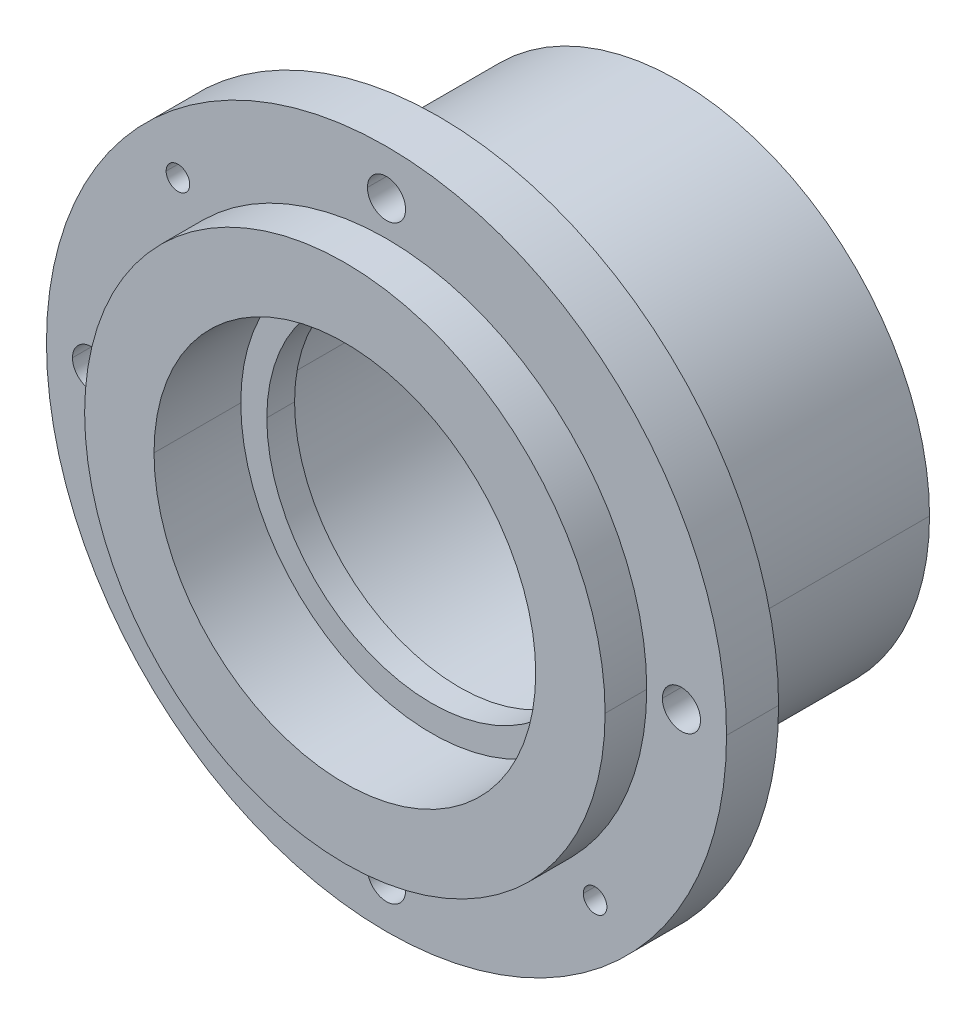
ISO-10303-21;
HEADER;
FILE_DESCRIPTION(('STEP AP214'),'2;1');
FILE_NAME('part.step','',(''),(''),'','','');
FILE_SCHEMA(('AUTOMOTIVE_DESIGN { 1 0 10303 214 1 1 1 1 }'));
ENDSEC;
DATA;
#1=APPLICATION_CONTEXT('core data for automotive mechanical design processes');
#2=APPLICATION_PROTOCOL_DEFINITION('international standard','automotive_design',2000,#1);
#3=PRODUCT_CONTEXT('',#1,'mechanical');
#4=PRODUCT('Part','Part','',(#3));
#5=PRODUCT_RELATED_PRODUCT_CATEGORY('part','',(#4));
#6=PRODUCT_DEFINITION_FORMATION('','',#4);
#7=PRODUCT_DEFINITION_CONTEXT('part definition',#1,'design');
#8=PRODUCT_DEFINITION('design','',#6,#7);
#9=PRODUCT_DEFINITION_SHAPE('','',#8);
#10=(LENGTH_UNIT() NAMED_UNIT(*) SI_UNIT(.MILLI.,.METRE.));
#11=(NAMED_UNIT(*) PLANE_ANGLE_UNIT() SI_UNIT($,.RADIAN.));
#12=(NAMED_UNIT(*) SI_UNIT($,.STERADIAN.) SOLID_ANGLE_UNIT());
#13=UNCERTAINTY_MEASURE_WITH_UNIT(LENGTH_MEASURE(1.E-05),#10,'distance_accuracy_value','');
#14=(GEOMETRIC_REPRESENTATION_CONTEXT(3) GLOBAL_UNCERTAINTY_ASSIGNED_CONTEXT((#13)) GLOBAL_UNIT_ASSIGNED_CONTEXT((#10,
#11,#12)) REPRESENTATION_CONTEXT('',''));
#15=CARTESIAN_POINT('',(0.,0.,0.));
#16=DIRECTION('',(0.,0.,1.));
#17=DIRECTION('',(1.,0.,0.));
#18=AXIS2_PLACEMENT_3D('',#15,#16,#17);
#19=CARTESIAN_POINT('',(60.104076401,-60.104076401,96.5));
#20=DIRECTION('',(0.,0.,-1.));
#21=DIRECTION('',(-1.,0.,0.));
#22=AXIS2_PLACEMENT_3D('',#19,#20,#21);
#23=CYLINDRICAL_SURFACE('',#22,3.4);
#24=DIRECTION('',(0.,0.,-1.));
#25=VECTOR('',#24,1.);
#26=CARTESIAN_POINT('',(63.504076401,-60.104076401,96.5));
#27=LINE('',#26,#25);
#28=CARTESIAN_POINT('',(63.504076401,-60.104076401,104.));
#29=VERTEX_POINT('',#28);
#30=CARTESIAN_POINT('',(63.504076401,-60.104076401,89.));
#31=VERTEX_POINT('',#30);
#32=EDGE_CURVE('E525',#29,#31,#27,.T.);
#33=ORIENTED_EDGE('',*,*,#32,.F.);
#34=CARTESIAN_POINT('',(60.104076401,-60.104076401,104.));
#35=DIRECTION('',(0.,0.,1.));
#36=DIRECTION('',(1.,0.,0.));
#37=AXIS2_PLACEMENT_3D('',#34,#35,#36);
#38=CIRCLE('',#37,3.4);
#39=CARTESIAN_POINT('',(56.704076401,-60.104076401,104.));
#40=VERTEX_POINT('',#39);
#41=EDGE_CURVE('E359',#29,#40,#38,.T.);
#42=ORIENTED_EDGE('',*,*,#41,.T.);
#43=DIRECTION('',(0.,0.,-1.));
#44=VECTOR('',#43,1.);
#45=CARTESIAN_POINT('',(56.704076401,-60.104076401,96.5));
#46=LINE('',#45,#44);
#47=CARTESIAN_POINT('',(56.704076401,-60.104076401,89.));
#48=VERTEX_POINT('',#47);
#49=EDGE_CURVE('E538',#40,#48,#46,.T.);
#50=ORIENTED_EDGE('',*,*,#49,.T.);
#51=CARTESIAN_POINT('',(60.104076401,-60.1040764007128,89.));
#52=DIRECTION('',(0.,0.,-1.));
#53=DIRECTION('',(1.,0.,0.));
#54=AXIS2_PLACEMENT_3D('',#51,#52,#53);
#55=CIRCLE('',#54,3.4);
#56=EDGE_CURVE('E242',#48,#31,#55,.T.);
#57=ORIENTED_EDGE('',*,*,#56,.T.);
#58=EDGE_LOOP('',(#33,#42,#50,#57));
#59=FACE_BOUND('',#58,.T.);
#60=ADVANCED_FACE('F16',(#59),#23,.F.);
#61=CARTESIAN_POINT('',(-60.104076401,60.104076401,96.5));
#62=DIRECTION('',(0.,0.,-1.));
#63=DIRECTION('',(-1.,0.,0.));
#64=AXIS2_PLACEMENT_3D('',#61,#62,#63);
#65=CYLINDRICAL_SURFACE('',#64,3.4);
#66=DIRECTION('',(0.,0.,-1.));
#67=VECTOR('',#66,1.);
#68=CARTESIAN_POINT('',(-56.704076401,60.104076401,96.5));
#69=LINE('',#68,#67);
#70=CARTESIAN_POINT('',(-56.704076401,60.104076401,104.));
#71=VERTEX_POINT('',#70);
#72=CARTESIAN_POINT('',(-56.704076401,60.104076401,89.));
#73=VERTEX_POINT('',#72);
#74=EDGE_CURVE('E256',#71,#73,#69,.T.);
#75=ORIENTED_EDGE('',*,*,#74,.F.);
#76=CARTESIAN_POINT('',(-60.104076401,60.104076401,104.));
#77=DIRECTION('',(0.,0.,1.));
#78=DIRECTION('',(1.,0.,0.));
#79=AXIS2_PLACEMENT_3D('',#76,#77,#78);
#80=CIRCLE('',#79,3.4);
#81=CARTESIAN_POINT('',(-63.504076401,60.104076401,104.));
#82=VERTEX_POINT('',#81);
#83=EDGE_CURVE('E248',#71,#82,#80,.T.);
#84=ORIENTED_EDGE('',*,*,#83,.T.);
#85=DIRECTION('',(0.,0.,-1.));
#86=VECTOR('',#85,1.);
#87=CARTESIAN_POINT('',(-63.504076401,60.104076401,96.5));
#88=LINE('',#87,#86);
#89=CARTESIAN_POINT('',(-63.504076401,60.104076401,89.));
#90=VERTEX_POINT('',#89);
#91=EDGE_CURVE('E246',#82,#90,#88,.T.);
#92=ORIENTED_EDGE('',*,*,#91,.T.);
#93=CARTESIAN_POINT('',(-60.104076401,60.1040764007131,89.));
#94=DIRECTION('',(0.,0.,-1.));
#95=DIRECTION('',(1.,0.,0.));
#96=AXIS2_PLACEMENT_3D('',#93,#94,#95);
#97=CIRCLE('',#96,3.4);
#98=EDGE_CURVE('E232',#90,#73,#97,.T.);
#99=ORIENTED_EDGE('',*,*,#98,.T.);
#100=EDGE_LOOP('',(#75,#84,#92,#99));
#101=FACE_BOUND('',#100,.T.);
#102=ADVANCED_FACE('F247',(#101),#65,.F.);
#103=CARTESIAN_POINT('',(-85.,0.,96.5));
#104=DIRECTION('',(0.,0.,-1.));
#105=DIRECTION('',(-1.,0.,0.));
#106=AXIS2_PLACEMENT_3D('',#103,#104,#105);
#107=CYLINDRICAL_SURFACE('',#106,5.5);
#108=DIRECTION('',(0.,0.,-1.));
#109=VECTOR('',#108,1.);
#110=CARTESIAN_POINT('',(-79.5,0.,96.5));
#111=LINE('',#110,#109);
#112=CARTESIAN_POINT('',(-79.5,0.,104.));
#113=VERTEX_POINT('',#112);
#114=CARTESIAN_POINT('',(-79.5,0.,89.));
#115=VERTEX_POINT('',#114);
#116=EDGE_CURVE('E283',#113,#115,#111,.T.);
#117=ORIENTED_EDGE('',*,*,#116,.F.);
#118=CARTESIAN_POINT('',(-85.,0.,104.));
#119=DIRECTION('',(0.,0.,1.));
#120=DIRECTION('',(1.,0.,0.));
#121=AXIS2_PLACEMENT_3D('',#118,#119,#120);
#122=CIRCLE('',#121,5.5);
#123=CARTESIAN_POINT('',(-90.5,0.,104.));
#124=VERTEX_POINT('',#123);
#125=EDGE_CURVE('E19',#113,#124,#122,.T.);
#126=ORIENTED_EDGE('',*,*,#125,.T.);
#127=DIRECTION('',(0.,0.,-1.));
#128=VECTOR('',#127,1.);
#129=CARTESIAN_POINT('',(-90.5,0.,96.5));
#130=LINE('',#129,#128);
#131=CARTESIAN_POINT('',(-90.5,0.,89.));
#132=VERTEX_POINT('',#131);
#133=EDGE_CURVE('E288',#124,#132,#130,.T.);
#134=ORIENTED_EDGE('',*,*,#133,.T.);
#135=CARTESIAN_POINT('',(-85.,1.78065548281E-12,89.));
#136=DIRECTION('',(0.,0.,-1.));
#137=DIRECTION('',(1.,0.,0.));
#138=AXIS2_PLACEMENT_3D('',#135,#136,#137);
#139=CIRCLE('',#138,5.5);
#140=EDGE_CURVE('E243',#132,#115,#139,.T.);
#141=ORIENTED_EDGE('',*,*,#140,.T.);
#142=EDGE_LOOP('',(#117,#126,#134,#141));
#143=FACE_BOUND('',#142,.T.);
#144=ADVANCED_FACE('F522',(#143),#107,.F.);
#145=CARTESIAN_POINT('',(0.,-85.,96.5));
#146=DIRECTION('',(0.,0.,-1.));
#147=DIRECTION('',(-1.,0.,0.));
#148=AXIS2_PLACEMENT_3D('',#145,#146,#147);
#149=CYLINDRICAL_SURFACE('',#148,5.5);
#150=DIRECTION('',(0.,0.,-1.));
#151=VECTOR('',#150,1.);
#152=CARTESIAN_POINT('',(5.5,-85.,96.5));
#153=LINE('',#152,#151);
#154=CARTESIAN_POINT('',(5.5,-85.,104.));
#155=VERTEX_POINT('',#154);
#156=CARTESIAN_POINT('',(5.5,-85.,89.));
#157=VERTEX_POINT('',#156);
#158=EDGE_CURVE('E302',#155,#157,#153,.T.);
#159=ORIENTED_EDGE('',*,*,#158,.F.);
#160=CARTESIAN_POINT('',(0.,-85.,104.));
#161=DIRECTION('',(0.,0.,1.));
#162=DIRECTION('',(1.,0.,0.));
#163=AXIS2_PLACEMENT_3D('',#160,#161,#162);
#164=CIRCLE('',#163,5.5);
#165=CARTESIAN_POINT('',(-5.5,-85.,104.));
#166=VERTEX_POINT('',#165);
#167=EDGE_CURVE('E463',#155,#166,#164,.T.);
#168=ORIENTED_EDGE('',*,*,#167,.T.);
#169=DIRECTION('',(0.,0.,-1.));
#170=VECTOR('',#169,1.);
#171=CARTESIAN_POINT('',(-5.5,-85.,96.5));
#172=LINE('',#171,#170);
#173=CARTESIAN_POINT('',(-5.5,-85.,89.));
#174=VERTEX_POINT('',#173);
#175=EDGE_CURVE('E306',#166,#174,#172,.T.);
#176=ORIENTED_EDGE('',*,*,#175,.T.);
#177=CARTESIAN_POINT('',(0.,-85.,89.));
#178=DIRECTION('',(0.,0.,-1.));
#179=DIRECTION('',(1.,0.,0.));
#180=AXIS2_PLACEMENT_3D('',#177,#178,#179);
#181=CIRCLE('',#180,5.5);
#182=EDGE_CURVE('E362',#174,#157,#181,.T.);
#183=ORIENTED_EDGE('',*,*,#182,.T.);
#184=EDGE_LOOP('',(#159,#168,#176,#183));
#185=FACE_BOUND('',#184,.T.);
#186=ADVANCED_FACE('F573',(#185),#149,.F.);
#187=CARTESIAN_POINT('',(85.,0.,96.5));
#188=DIRECTION('',(0.,0.,-1.));
#189=DIRECTION('',(-1.,0.,0.));
#190=AXIS2_PLACEMENT_3D('',#187,#188,#189);
#191=CYLINDRICAL_SURFACE('',#190,5.5);
#192=DIRECTION('',(0.,0.,-1.));
#193=VECTOR('',#192,1.);
#194=CARTESIAN_POINT('',(90.5,0.,96.5));
#195=LINE('',#194,#193);
#196=CARTESIAN_POINT('',(90.5,0.,104.));
#197=VERTEX_POINT('',#196);
#198=CARTESIAN_POINT('',(90.5,0.,89.));
#199=VERTEX_POINT('',#198);
#200=EDGE_CURVE('E315',#197,#199,#195,.T.);
#201=ORIENTED_EDGE('',*,*,#200,.F.);
#202=CARTESIAN_POINT('',(85.,0.,104.));
#203=DIRECTION('',(0.,0.,1.));
#204=DIRECTION('',(1.,0.,0.));
#205=AXIS2_PLACEMENT_3D('',#202,#203,#204);
#206=CIRCLE('',#205,5.5);
#207=CARTESIAN_POINT('',(79.5,0.,104.));
#208=VERTEX_POINT('',#207);
#209=EDGE_CURVE('E461',#197,#208,#206,.T.);
#210=ORIENTED_EDGE('',*,*,#209,.T.);
#211=DIRECTION('',(0.,0.,-1.));
#212=VECTOR('',#211,1.);
#213=CARTESIAN_POINT('',(79.5,0.,96.5));
#214=LINE('',#213,#212);
#215=CARTESIAN_POINT('',(79.5,0.,89.));
#216=VERTEX_POINT('',#215);
#217=EDGE_CURVE('E323',#208,#216,#214,.T.);
#218=ORIENTED_EDGE('',*,*,#217,.T.);
#219=CARTESIAN_POINT('',(85.,-5.93551827603332E-13,89.));
#220=DIRECTION('',(0.,0.,-1.));
#221=DIRECTION('',(1.,0.,0.));
#222=AXIS2_PLACEMENT_3D('',#219,#220,#221);
#223=CIRCLE('',#222,5.5);
#224=EDGE_CURVE('E408',#216,#199,#223,.T.);
#225=ORIENTED_EDGE('',*,*,#224,.T.);
#226=EDGE_LOOP('',(#201,#210,#218,#225));
#227=FACE_BOUND('',#226,.T.);
#228=ADVANCED_FACE('F580',(#227),#191,.F.);
#229=CARTESIAN_POINT('',(0.,85.,96.5));
#230=DIRECTION('',(0.,0.,-1.));
#231=DIRECTION('',(-1.,0.,0.));
#232=AXIS2_PLACEMENT_3D('',#229,#230,#231);
#233=CYLINDRICAL_SURFACE('',#232,5.5);
#234=DIRECTION('',(0.,0.,-1.));
#235=VECTOR('',#234,1.);
#236=CARTESIAN_POINT('',(5.5,85.,96.5));
#237=LINE('',#236,#235);
#238=CARTESIAN_POINT('',(5.5,85.,104.));
#239=VERTEX_POINT('',#238);
#240=CARTESIAN_POINT('',(5.5,85.,89.));
#241=VERTEX_POINT('',#240);
#242=EDGE_CURVE('E289',#239,#241,#237,.T.);
#243=ORIENTED_EDGE('',*,*,#242,.F.);
#244=CARTESIAN_POINT('',(0.,85.,104.));
#245=DIRECTION('',(0.,0.,1.));
#246=DIRECTION('',(1.,0.,0.));
#247=AXIS2_PLACEMENT_3D('',#244,#245,#246);
#248=CIRCLE('',#247,5.5);
#249=CARTESIAN_POINT('',(-5.5,85.,104.));
#250=VERTEX_POINT('',#249);
#251=EDGE_CURVE('E267',#239,#250,#248,.T.);
#252=ORIENTED_EDGE('',*,*,#251,.T.);
#253=DIRECTION('',(0.,0.,-1.));
#254=VECTOR('',#253,1.);
#255=CARTESIAN_POINT('',(-5.5,85.,96.5));
#256=LINE('',#255,#254);
#257=CARTESIAN_POINT('',(-5.5,85.,89.));
#258=VERTEX_POINT('',#257);
#259=EDGE_CURVE('E339',#250,#258,#256,.T.);
#260=ORIENTED_EDGE('',*,*,#259,.T.);
#261=CARTESIAN_POINT('',(0.,85.,89.));
#262=DIRECTION('',(0.,0.,-1.));
#263=DIRECTION('',(1.,0.,0.));
#264=AXIS2_PLACEMENT_3D('',#261,#262,#263);
#265=CIRCLE('',#264,5.5);
#266=EDGE_CURVE('E271',#258,#241,#265,.T.);
#267=ORIENTED_EDGE('',*,*,#266,.T.);
#268=EDGE_LOOP('',(#243,#252,#260,#267));
#269=FACE_BOUND('',#268,.T.);
#270=ADVANCED_FACE('F477',(#269),#233,.F.);
#271=CARTESIAN_POINT('',(0.,0.,103.5));
#272=DIRECTION('',(0.,0.,1.));
#273=DIRECTION('',(1.,0.,0.));
#274=AXIS2_PLACEMENT_3D('',#271,#272,#273);
#275=CYLINDRICAL_SURFACE('',#274,55.);
#276=DIRECTION('',(0.,0.,1.));
#277=VECTOR('',#276,1.);
#278=CARTESIAN_POINT('',(-55.,0.,103.5));
#279=LINE('',#278,#277);
#280=CARTESIAN_POINT('',(-55.,0.,91.));
#281=VERTEX_POINT('',#280);
#282=CARTESIAN_POINT('',(-55.,0.,116.));
#283=VERTEX_POINT('',#282);
#284=EDGE_CURVE('E347',#281,#283,#279,.T.);
#285=ORIENTED_EDGE('',*,*,#284,.F.);
#286=CARTESIAN_POINT('',(0.,0.,91.));
#287=DIRECTION('',(0.,0.,1.));
#288=DIRECTION('',(1.,0.,0.));
#289=AXIS2_PLACEMENT_3D('',#286,#287,#288);
#290=CIRCLE('',#289,55.);
#291=CARTESIAN_POINT('',(55.,0.,91.));
#292=VERTEX_POINT('',#291);
#293=EDGE_CURVE('E455',#292,#281,#290,.T.);
#294=ORIENTED_EDGE('',*,*,#293,.F.);
#295=DIRECTION('',(0.,0.,1.));
#296=VECTOR('',#295,1.);
#297=CARTESIAN_POINT('',(55.,0.,103.5));
#298=LINE('',#297,#296);
#299=CARTESIAN_POINT('',(55.,0.,116.));
#300=VERTEX_POINT('',#299);
#301=EDGE_CURVE('E366',#292,#300,#298,.T.);
#302=ORIENTED_EDGE('',*,*,#301,.T.);
#303=CARTESIAN_POINT('',(0.,0.,116.));
#304=DIRECTION('',(0.,0.,1.));
#305=DIRECTION('',(1.,0.,0.));
#306=AXIS2_PLACEMENT_3D('',#303,#304,#305);
#307=CIRCLE('',#306,55.);
#308=EDGE_CURVE('E10',#300,#283,#307,.T.);
#309=ORIENTED_EDGE('',*,*,#308,.T.);
#310=EDGE_LOOP('',(#285,#294,#302,#309));
#311=FACE_BOUND('',#310,.T.);
#312=ADVANCED_FACE('F609',(#311),#275,.F.);
#313=CARTESIAN_POINT('',(0.,0.,110.));
#314=DIRECTION('',(0.,0.,1.));
#315=DIRECTION('',(1.,0.,0.));
#316=AXIS2_PLACEMENT_3D('',#313,#314,#315);
#317=CYLINDRICAL_SURFACE('',#316,75.);
#318=DIRECTION('',(0.,0.,1.));
#319=VECTOR('',#318,1.);
#320=CARTESIAN_POINT('',(-75.,0.,110.));
#321=LINE('',#320,#319);
#322=CARTESIAN_POINT('',(-75.,0.,104.));
#323=VERTEX_POINT('',#322);
#324=CARTESIAN_POINT('',(-75.,0.,116.));
#325=VERTEX_POINT('',#324);
#326=EDGE_CURVE('E374',#323,#325,#321,.T.);
#327=ORIENTED_EDGE('',*,*,#326,.F.);
#328=CARTESIAN_POINT('',(0.,0.,104.));
#329=DIRECTION('',(0.,0.,1.));
#330=DIRECTION('',(1.,0.,0.));
#331=AXIS2_PLACEMENT_3D('',#328,#329,#330);
#332=CIRCLE('',#331,75.);
#333=CARTESIAN_POINT('',(75.,0.,104.));
#334=VERTEX_POINT('',#333);
#335=EDGE_CURVE('E432',#323,#334,#332,.T.);
#336=ORIENTED_EDGE('',*,*,#335,.T.);
#337=DIRECTION('',(0.,0.,1.));
#338=VECTOR('',#337,1.);
#339=CARTESIAN_POINT('',(75.,0.,110.));
#340=LINE('',#339,#338);
#341=CARTESIAN_POINT('',(75.,0.,116.));
#342=VERTEX_POINT('',#341);
#343=EDGE_CURVE('E379',#334,#342,#340,.T.);
#344=ORIENTED_EDGE('',*,*,#343,.T.);
#345=CARTESIAN_POINT('',(0.,0.,116.));
#346=DIRECTION('',(0.,0.,1.));
#347=DIRECTION('',(1.,0.,0.));
#348=AXIS2_PLACEMENT_3D('',#345,#346,#347);
#349=CIRCLE('',#348,75.);
#350=EDGE_CURVE('E25',#325,#342,#349,.T.);
#351=ORIENTED_EDGE('',*,*,#350,.F.);
#352=EDGE_LOOP('',(#327,#336,#344,#351));
#353=FACE_BOUND('',#352,.T.);
#354=ADVANCED_FACE('F606',(#353),#317,.T.);
#355=CARTESIAN_POINT('',(0.,0.,96.5));
#356=DIRECTION('',(0.,0.,-1.));
#357=DIRECTION('',(-1.,0.,0.));
#358=AXIS2_PLACEMENT_3D('',#355,#356,#357);
#359=CYLINDRICAL_SURFACE('',#358,98.);
#360=DIRECTION('',(0.,0.,-1.));
#361=VECTOR('',#360,1.);
#362=CARTESIAN_POINT('',(98.,0.,96.5));
#363=LINE('',#362,#361);
#364=CARTESIAN_POINT('',(98.,0.,104.));
#365=VERTEX_POINT('',#364);
#366=CARTESIAN_POINT('',(98.,0.,89.));
#367=VERTEX_POINT('',#366);
#368=EDGE_CURVE('E387',#365,#367,#363,.T.);
#369=ORIENTED_EDGE('',*,*,#368,.F.);
#370=CARTESIAN_POINT('',(0.,0.,104.));
#371=DIRECTION('',(0.,0.,1.));
#372=DIRECTION('',(1.,0.,0.));
#373=AXIS2_PLACEMENT_3D('',#370,#371,#372);
#374=CIRCLE('',#373,98.);
#375=CARTESIAN_POINT('',(-98.,0.,104.));
#376=VERTEX_POINT('',#375);
#377=EDGE_CURVE('E429',#376,#365,#374,.T.);
#378=ORIENTED_EDGE('',*,*,#377,.F.);
#379=DIRECTION('',(0.,0.,-1.));
#380=VECTOR('',#379,1.);
#381=CARTESIAN_POINT('',(-98.,0.,96.5));
#382=LINE('',#381,#380);
#383=CARTESIAN_POINT('',(-98.,-7.08333419676543E-13,89.));
#384=VERTEX_POINT('',#383);
#385=EDGE_CURVE('E397',#376,#384,#382,.T.);
#386=ORIENTED_EDGE('',*,*,#385,.T.);
#387=CARTESIAN_POINT('',(0.,0.,89.));
#388=DIRECTION('',(0.,0.,-1.));
#389=DIRECTION('',(-1.,0.,0.));
#390=AXIS2_PLACEMENT_3D('',#387,#388,#389);
#391=CIRCLE('',#390,98.);
#392=EDGE_CURVE('E272',#367,#384,#391,.T.);
#393=ORIENTED_EDGE('',*,*,#392,.F.);
#394=EDGE_LOOP('',(#369,#378,#386,#393));
#395=FACE_BOUND('',#394,.T.);
#396=ADVANCED_FACE('F496',(#395),#359,.T.);
#397=CARTESIAN_POINT('',(0.,0.,87.));
#398=DIRECTION('',(0.,0.,-1.));
#399=DIRECTION('',(-1.,0.,0.));
#400=AXIS2_PLACEMENT_3D('',#397,#398,#399);
#401=CYLINDRICAL_SURFACE('',#400,47.5);
#402=DIRECTION('',(0.,0.,-1.));
#403=VECTOR('',#402,1.);
#404=CARTESIAN_POINT('',(47.5,0.,87.));
#405=LINE('',#404,#403);
#406=CARTESIAN_POINT('',(47.5,0.,91.));
#407=VERTEX_POINT('',#406);
#408=CARTESIAN_POINT('',(47.5,0.,83.));
#409=VERTEX_POINT('',#408);
#410=EDGE_CURVE('E405',#407,#409,#405,.T.);
#411=ORIENTED_EDGE('',*,*,#410,.F.);
#412=CARTESIAN_POINT('',(0.,0.,91.));
#413=DIRECTION('',(0.,0.,1.));
#414=DIRECTION('',(1.,0.,0.));
#415=AXIS2_PLACEMENT_3D('',#412,#413,#414);
#416=CIRCLE('',#415,47.5);
#417=CARTESIAN_POINT('',(-47.5,0.,91.));
#418=VERTEX_POINT('',#417);
#419=EDGE_CURVE('E433',#407,#418,#416,.T.);
#420=ORIENTED_EDGE('',*,*,#419,.T.);
#421=DIRECTION('',(0.,0.,-1.));
#422=VECTOR('',#421,1.);
#423=CARTESIAN_POINT('',(-47.5,0.,87.));
#424=LINE('',#423,#422);
#425=CARTESIAN_POINT('',(-47.5,0.,83.));
#426=VERTEX_POINT('',#425);
#427=EDGE_CURVE('E279',#418,#426,#424,.T.);
#428=ORIENTED_EDGE('',*,*,#427,.T.);
#429=CARTESIAN_POINT('',(0.,0.,83.));
#430=DIRECTION('',(0.,0.,-1.));
#431=DIRECTION('',(1.,0.,0.));
#432=AXIS2_PLACEMENT_3D('',#429,#430,#431);
#433=CIRCLE('',#432,47.5);
#434=EDGE_CURVE('E305',#426,#409,#433,.T.);
#435=ORIENTED_EDGE('',*,*,#434,.T.);
#436=EDGE_LOOP('',(#411,#420,#428,#435));
#437=FACE_BOUND('',#436,.T.);
#438=ADVANCED_FACE('F597',(#437),#401,.F.);
#439=CARTESIAN_POINT('',(0.,0.,51.5));
#440=DIRECTION('',(0.,0.,-1.));
#441=DIRECTION('',(-1.,0.,0.));
#442=AXIS2_PLACEMENT_3D('',#439,#440,#441);
#443=CYLINDRICAL_SURFACE('',#442,55.);
#444=DIRECTION('',(0.,0.,-1.));
#445=VECTOR('',#444,1.);
#446=CARTESIAN_POINT('',(55.,0.,51.5));
#447=LINE('',#446,#445);
#448=CARTESIAN_POINT('',(55.,0.,83.));
#449=VERTEX_POINT('',#448);
#450=CARTESIAN_POINT('',(55.,0.,20.));
#451=VERTEX_POINT('',#450);
#452=EDGE_CURVE('E278',#449,#451,#447,.T.);
#453=ORIENTED_EDGE('',*,*,#452,.F.);
#454=CARTESIAN_POINT('',(0.,0.,83.));
#455=DIRECTION('',(0.,0.,-1.));
#456=DIRECTION('',(1.,0.,0.));
#457=AXIS2_PLACEMENT_3D('',#454,#455,#456);
#458=CIRCLE('',#457,55.);
#459=CARTESIAN_POINT('',(-55.,0.,83.));
#460=VERTEX_POINT('',#459);
#461=EDGE_CURVE('E444',#460,#449,#458,.T.);
#462=ORIENTED_EDGE('',*,*,#461,.F.);
#463=DIRECTION('',(0.,0.,-1.));
#464=VECTOR('',#463,1.);
#465=CARTESIAN_POINT('',(-55.,0.,51.5));
#466=LINE('',#465,#464);
#467=CARTESIAN_POINT('',(-55.,0.,20.));
#468=VERTEX_POINT('',#467);
#469=EDGE_CURVE('E352',#460,#468,#466,.T.);
#470=ORIENTED_EDGE('',*,*,#469,.T.);
#471=CARTESIAN_POINT('',(0.,0.,20.));
#472=DIRECTION('',(0.,0.,1.));
#473=DIRECTION('',(1.,0.,0.));
#474=AXIS2_PLACEMENT_3D('',#471,#472,#473);
#475=CIRCLE('',#474,55.);
#476=EDGE_CURVE('E441',#451,#468,#475,.T.);
#477=ORIENTED_EDGE('',*,*,#476,.F.);
#478=EDGE_LOOP('',(#453,#462,#470,#477));
#479=FACE_BOUND('',#478,.T.);
#480=ADVANCED_FACE('F589',(#479),#443,.F.);
#481=CARTESIAN_POINT('',(0.,0.,54.5));
#482=DIRECTION('',(0.,0.,-1.));
#483=DIRECTION('',(-1.,0.,0.));
#484=AXIS2_PLACEMENT_3D('',#481,#482,#483);
#485=CYLINDRICAL_SURFACE('',#484,72.5);
#486=DIRECTION('',(0.,0.,-1.));
#487=VECTOR('',#486,1.);
#488=CARTESIAN_POINT('',(72.5,0.,54.5));
#489=LINE('',#488,#487);
#490=CARTESIAN_POINT('',(72.5,0.,89.));
#491=VERTEX_POINT('',#490);
#492=CARTESIAN_POINT('',(72.5,0.,20.));
#493=VERTEX_POINT('',#492);
#494=EDGE_CURVE('E335',#491,#493,#489,.T.);
#495=ORIENTED_EDGE('',*,*,#494,.F.);
#496=CARTESIAN_POINT('',(0.,0.,89.));
#497=DIRECTION('',(0.,0.,-1.));
#498=DIRECTION('',(-1.,0.,0.));
#499=AXIS2_PLACEMENT_3D('',#496,#497,#498);
#500=CIRCLE('',#499,72.5);
#501=CARTESIAN_POINT('',(-72.5,-5.24022172719891E-13,89.));
#502=VERTEX_POINT('',#501);
#503=EDGE_CURVE('E269',#491,#502,#500,.T.);
#504=ORIENTED_EDGE('',*,*,#503,.T.);
#505=DIRECTION('',(0.,0.,-1.));
#506=VECTOR('',#505,1.);
#507=CARTESIAN_POINT('',(-72.5,0.,54.5));
#508=LINE('',#507,#506);
#509=CARTESIAN_POINT('',(-72.5,0.,20.));
#510=VERTEX_POINT('',#509);
#511=EDGE_CURVE('E334',#502,#510,#508,.T.);
#512=ORIENTED_EDGE('',*,*,#511,.T.);
#513=CARTESIAN_POINT('',(0.,0.,20.));
#514=DIRECTION('',(0.,0.,1.));
#515=DIRECTION('',(1.,0.,0.));
#516=AXIS2_PLACEMENT_3D('',#513,#514,#515);
#517=CIRCLE('',#516,72.5);
#518=EDGE_CURVE('E38',#510,#493,#517,.T.);
#519=ORIENTED_EDGE('',*,*,#518,.T.);
#520=EDGE_LOOP('',(#495,#504,#512,#519));
#521=FACE_BOUND('',#520,.T.);
#522=ADVANCED_FACE('F587',(#521),#485,.T.);
#523=CARTESIAN_POINT('',(0.,0.,116.));
#524=DIRECTION('',(0.,0.,1.));
#525=DIRECTION('',(1.,0.,0.));
#526=AXIS2_PLACEMENT_3D('',#523,#524,#525);
#527=PLANE('',#526);
#528=ORIENTED_EDGE('',*,*,#308,.F.);
#529=CARTESIAN_POINT('',(0.,0.,116.));
#530=DIRECTION('',(0.,0.,1.));
#531=DIRECTION('',(1.,0.,0.));
#532=AXIS2_PLACEMENT_3D('',#529,#530,#531);
#533=CIRCLE('',#532,55.);
#534=EDGE_CURVE('E356',#283,#300,#533,.T.);
#535=ORIENTED_EDGE('',*,*,#534,.F.);
#536=EDGE_LOOP('',(#528,#535));
#537=FACE_BOUND('',#536,.T.);
#538=CARTESIAN_POINT('',(0.,0.,116.));
#539=DIRECTION('',(0.,0.,1.));
#540=DIRECTION('',(1.,0.,0.));
#541=AXIS2_PLACEMENT_3D('',#538,#539,#540);
#542=CIRCLE('',#541,75.);
#543=EDGE_CURVE('E375',#342,#325,#542,.T.);
#544=ORIENTED_EDGE('',*,*,#543,.T.);
#545=ORIENTED_EDGE('',*,*,#350,.T.);
#546=EDGE_LOOP('',(#544,#545));
#547=FACE_BOUND('',#546,.T.);
#548=ADVANCED_FACE('F487',(#537,#547),#527,.T.);
#549=CARTESIAN_POINT('',(0.,0.,104.));
#550=DIRECTION('',(0.,0.,1.));
#551=DIRECTION('',(1.,0.,0.));
#552=AXIS2_PLACEMENT_3D('',#549,#550,#551);
#553=PLANE('',#552);
#554=CARTESIAN_POINT('',(60.104076401,-60.104076401,104.));
#555=DIRECTION('',(0.,0.,1.));
#556=DIRECTION('',(1.,0.,0.));
#557=AXIS2_PLACEMENT_3D('',#554,#555,#556);
#558=CIRCLE('',#557,3.4);
#559=EDGE_CURVE('E534',#40,#29,#558,.T.);
#560=ORIENTED_EDGE('',*,*,#559,.F.);
#561=ORIENTED_EDGE('',*,*,#41,.F.);
#562=EDGE_LOOP('',(#560,#561));
#563=FACE_BOUND('',#562,.T.);
#564=CARTESIAN_POINT('',(-60.104076401,60.104076401,104.));
#565=DIRECTION('',(0.,0.,1.));
#566=DIRECTION('',(1.,0.,0.));
#567=AXIS2_PLACEMENT_3D('',#564,#565,#566);
#568=CIRCLE('',#567,3.4);
#569=EDGE_CURVE('E263',#82,#71,#568,.T.);
#570=ORIENTED_EDGE('',*,*,#569,.F.);
#571=ORIENTED_EDGE('',*,*,#83,.F.);
#572=EDGE_LOOP('',(#570,#571));
#573=FACE_BOUND('',#572,.T.);
#574=CARTESIAN_POINT('',(-85.,0.,104.));
#575=DIRECTION('',(0.,0.,1.));
#576=DIRECTION('',(1.,0.,0.));
#577=AXIS2_PLACEMENT_3D('',#574,#575,#576);
#578=CIRCLE('',#577,5.5);
#579=EDGE_CURVE('E253',#124,#113,#578,.T.);
#580=ORIENTED_EDGE('',*,*,#579,.F.);
#581=ORIENTED_EDGE('',*,*,#125,.F.);
#582=EDGE_LOOP('',(#580,#581));
#583=FACE_BOUND('',#582,.T.);
#584=CARTESIAN_POINT('',(0.,-85.,104.));
#585=DIRECTION('',(0.,0.,1.));
#586=DIRECTION('',(1.,0.,0.));
#587=AXIS2_PLACEMENT_3D('',#584,#585,#586);
#588=CIRCLE('',#587,5.5);
#589=EDGE_CURVE('E298',#166,#155,#588,.T.);
#590=ORIENTED_EDGE('',*,*,#589,.F.);
#591=ORIENTED_EDGE('',*,*,#167,.F.);
#592=EDGE_LOOP('',(#590,#591));
#593=FACE_BOUND('',#592,.T.);
#594=CARTESIAN_POINT('',(85.,0.,104.));
#595=DIRECTION('',(0.,0.,1.));
#596=DIRECTION('',(1.,0.,0.));
#597=AXIS2_PLACEMENT_3D('',#594,#595,#596);
#598=CIRCLE('',#597,5.5);
#599=EDGE_CURVE('E310',#208,#197,#598,.T.);
#600=ORIENTED_EDGE('',*,*,#599,.F.);
#601=ORIENTED_EDGE('',*,*,#209,.F.);
#602=EDGE_LOOP('',(#600,#601));
#603=FACE_BOUND('',#602,.T.);
#604=CARTESIAN_POINT('',(0.,85.,104.));
#605=DIRECTION('',(0.,0.,1.));
#606=DIRECTION('',(1.,0.,0.));
#607=AXIS2_PLACEMENT_3D('',#604,#605,#606);
#608=CIRCLE('',#607,5.5);
#609=EDGE_CURVE('E294',#250,#239,#608,.T.);
#610=ORIENTED_EDGE('',*,*,#609,.F.);
#611=ORIENTED_EDGE('',*,*,#251,.F.);
#612=EDGE_LOOP('',(#610,#611));
#613=FACE_BOUND('',#612,.T.);
#614=CARTESIAN_POINT('',(0.,0.,104.));
#615=DIRECTION('',(0.,0.,1.));
#616=DIRECTION('',(1.,0.,0.));
#617=AXIS2_PLACEMENT_3D('',#614,#615,#616);
#618=CIRCLE('',#617,75.);
#619=EDGE_CURVE('E370',#334,#323,#618,.T.);
#620=ORIENTED_EDGE('',*,*,#619,.F.);
#621=ORIENTED_EDGE('',*,*,#335,.F.);
#622=EDGE_LOOP('',(#620,#621));
#623=FACE_BOUND('',#622,.T.);
#624=ORIENTED_EDGE('',*,*,#377,.T.);
#625=CARTESIAN_POINT('',(0.,0.,104.));
#626=DIRECTION('',(0.,0.,1.));
#627=DIRECTION('',(1.,0.,0.));
#628=AXIS2_PLACEMENT_3D('',#625,#626,#627);
#629=CIRCLE('',#628,98.);
#630=EDGE_CURVE('E383',#365,#376,#629,.T.);
#631=ORIENTED_EDGE('',*,*,#630,.T.);
#632=EDGE_LOOP('',(#624,#631));
#633=FACE_BOUND('',#632,.T.);
#634=ADVANCED_FACE('F483',(#563,#573,#583,#593,#603,#613,#623,#633),#553,.T.);
#635=CARTESIAN_POINT('',(0.,0.,91.));
#636=DIRECTION('',(0.,0.,1.));
#637=DIRECTION('',(1.,0.,0.));
#638=AXIS2_PLACEMENT_3D('',#635,#636,#637);
#639=PLANE('',#638);
#640=CARTESIAN_POINT('',(0.,0.,91.));
#641=DIRECTION('',(0.,0.,1.));
#642=DIRECTION('',(1.,0.,0.));
#643=AXIS2_PLACEMENT_3D('',#640,#641,#642);
#644=CIRCLE('',#643,47.5);
#645=EDGE_CURVE('E401',#418,#407,#644,.T.);
#646=ORIENTED_EDGE('',*,*,#645,.F.);
#647=ORIENTED_EDGE('',*,*,#419,.F.);
#648=EDGE_LOOP('',(#646,#647));
#649=FACE_BOUND('',#648,.T.);
#650=ORIENTED_EDGE('',*,*,#293,.T.);
#651=CARTESIAN_POINT('',(0.,0.,91.));
#652=DIRECTION('',(0.,0.,1.));
#653=DIRECTION('',(1.,0.,0.));
#654=AXIS2_PLACEMENT_3D('',#651,#652,#653);
#655=CIRCLE('',#654,55.);
#656=EDGE_CURVE('E343',#281,#292,#655,.T.);
#657=ORIENTED_EDGE('',*,*,#656,.T.);
#658=EDGE_LOOP('',(#650,#657));
#659=FACE_BOUND('',#658,.T.);
#660=ADVANCED_FACE('F486',(#649,#659),#639,.T.);
#661=CARTESIAN_POINT('',(0.,0.,89.));
#662=DIRECTION('',(0.,0.,-1.));
#663=DIRECTION('',(0.,-1.,0.));
#664=AXIS2_PLACEMENT_3D('',#661,#662,#663);
#665=PLANE('',#664);
#666=ORIENTED_EDGE('',*,*,#56,.F.);
#667=CARTESIAN_POINT('',(60.104076401,-60.1040764007128,89.));
#668=DIRECTION('',(0.,0.,-1.));
#669=DIRECTION('',(1.,0.,0.));
#670=AXIS2_PLACEMENT_3D('',#667,#668,#669);
#671=CIRCLE('',#670,3.4);
#672=EDGE_CURVE('E533',#31,#48,#671,.T.);
#673=ORIENTED_EDGE('',*,*,#672,.F.);
#674=EDGE_LOOP('',(#666,#673));
#675=FACE_BOUND('',#674,.T.);
#676=ORIENTED_EDGE('',*,*,#98,.F.);
#677=CARTESIAN_POINT('',(-60.104076401,60.1040764007131,89.));
#678=DIRECTION('',(0.,0.,-1.));
#679=DIRECTION('',(1.,0.,0.));
#680=AXIS2_PLACEMENT_3D('',#677,#678,#679);
#681=CIRCLE('',#680,3.4);
#682=EDGE_CURVE('E237',#73,#90,#681,.T.);
#683=ORIENTED_EDGE('',*,*,#682,.F.);
#684=EDGE_LOOP('',(#676,#683));
#685=FACE_BOUND('',#684,.T.);
#686=ORIENTED_EDGE('',*,*,#140,.F.);
#687=CARTESIAN_POINT('',(-85.,1.78065548281E-12,89.));
#688=DIRECTION('',(0.,0.,-1.));
#689=DIRECTION('',(1.,0.,0.));
#690=AXIS2_PLACEMENT_3D('',#687,#688,#689);
#691=CIRCLE('',#690,5.5);
#692=EDGE_CURVE('E284',#115,#132,#691,.T.);
#693=ORIENTED_EDGE('',*,*,#692,.F.);
#694=EDGE_LOOP('',(#686,#693));
#695=FACE_BOUND('',#694,.T.);
#696=ORIENTED_EDGE('',*,*,#182,.F.);
#697=CARTESIAN_POINT('',(0.,-85.,89.));
#698=DIRECTION('',(0.,0.,-1.));
#699=DIRECTION('',(1.,0.,0.));
#700=AXIS2_PLACEMENT_3D('',#697,#698,#699);
#701=CIRCLE('',#700,5.5);
#702=EDGE_CURVE('E311',#157,#174,#701,.T.);
#703=ORIENTED_EDGE('',*,*,#702,.F.);
#704=EDGE_LOOP('',(#696,#703));
#705=FACE_BOUND('',#704,.T.);
#706=ORIENTED_EDGE('',*,*,#224,.F.);
#707=CARTESIAN_POINT('',(85.,-5.93551827603332E-13,89.));
#708=DIRECTION('',(0.,0.,-1.));
#709=DIRECTION('',(1.,0.,0.));
#710=AXIS2_PLACEMENT_3D('',#707,#708,#709);
#711=CIRCLE('',#710,5.5);
#712=EDGE_CURVE('E319',#199,#216,#711,.T.);
#713=ORIENTED_EDGE('',*,*,#712,.F.);
#714=EDGE_LOOP('',(#706,#713));
#715=FACE_BOUND('',#714,.T.);
#716=ORIENTED_EDGE('',*,*,#266,.F.);
#717=CARTESIAN_POINT('',(0.,85.,89.));
#718=DIRECTION('',(0.,0.,-1.));
#719=DIRECTION('',(1.,0.,0.));
#720=AXIS2_PLACEMENT_3D('',#717,#718,#719);
#721=CIRCLE('',#720,5.5);
#722=EDGE_CURVE('E293',#241,#258,#721,.T.);
#723=ORIENTED_EDGE('',*,*,#722,.F.);
#724=EDGE_LOOP('',(#716,#723));
#725=FACE_BOUND('',#724,.T.);
#726=CARTESIAN_POINT('',(0.,0.,89.));
#727=DIRECTION('',(0.,0.,-1.));
#728=DIRECTION('',(-1.,0.,0.));
#729=AXIS2_PLACEMENT_3D('',#726,#727,#728);
#730=CIRCLE('',#729,72.5);
#731=EDGE_CURVE('E425',#502,#491,#730,.T.);
#732=ORIENTED_EDGE('',*,*,#731,.F.);
#733=ORIENTED_EDGE('',*,*,#503,.F.);
#734=EDGE_LOOP('',(#732,#733));
#735=FACE_BOUND('',#734,.T.);
#736=CARTESIAN_POINT('',(0.,0.,89.));
#737=DIRECTION('',(0.,0.,-1.));
#738=DIRECTION('',(-1.,0.,0.));
#739=AXIS2_PLACEMENT_3D('',#736,#737,#738);
#740=CIRCLE('',#739,98.);
#741=EDGE_CURVE('E393',#384,#367,#740,.T.);
#742=ORIENTED_EDGE('',*,*,#741,.T.);
#743=ORIENTED_EDGE('',*,*,#392,.T.);
#744=EDGE_LOOP('',(#742,#743));
#745=FACE_BOUND('',#744,.T.);
#746=ADVANCED_FACE('F234',(#675,#685,#695,#705,#715,#725,#735,#745),#665,.T.);
#747=CARTESIAN_POINT('',(0.,0.,83.));
#748=DIRECTION('',(0.,0.,-1.));
#749=DIRECTION('',(0.,-1.,0.));
#750=AXIS2_PLACEMENT_3D('',#747,#748,#749);
#751=PLANE('',#750);
#752=ORIENTED_EDGE('',*,*,#434,.F.);
#753=CARTESIAN_POINT('',(0.,0.,83.));
#754=DIRECTION('',(0.,0.,-1.));
#755=DIRECTION('',(1.,0.,0.));
#756=AXIS2_PLACEMENT_3D('',#753,#754,#755);
#757=CIRCLE('',#756,47.5);
#758=EDGE_CURVE('E411',#409,#426,#757,.T.);
#759=ORIENTED_EDGE('',*,*,#758,.F.);
#760=EDGE_LOOP('',(#752,#759));
#761=FACE_BOUND('',#760,.T.);
#762=ORIENTED_EDGE('',*,*,#461,.T.);
#763=CARTESIAN_POINT('',(0.,0.,83.));
#764=DIRECTION('',(0.,0.,-1.));
#765=DIRECTION('',(1.,0.,0.));
#766=AXIS2_PLACEMENT_3D('',#763,#764,#765);
#767=CIRCLE('',#766,55.);
#768=EDGE_CURVE('E274',#449,#460,#767,.T.);
#769=ORIENTED_EDGE('',*,*,#768,.T.);
#770=EDGE_LOOP('',(#762,#769));
#771=FACE_BOUND('',#770,.T.);
#772=ADVANCED_FACE('F502',(#761,#771),#751,.T.);
#773=CARTESIAN_POINT('',(0.,0.,20.));
#774=DIRECTION('',(0.,0.,-1.));
#775=DIRECTION('',(0.,-1.,0.));
#776=AXIS2_PLACEMENT_3D('',#773,#774,#775);
#777=PLANE('',#776);
#778=CARTESIAN_POINT('',(0.,0.,20.));
#779=DIRECTION('',(0.,0.,1.));
#780=DIRECTION('',(1.,0.,0.));
#781=AXIS2_PLACEMENT_3D('',#778,#779,#780);
#782=CIRCLE('',#781,55.);
#783=EDGE_CURVE('E348',#468,#451,#782,.T.);
#784=ORIENTED_EDGE('',*,*,#783,.T.);
#785=ORIENTED_EDGE('',*,*,#476,.T.);
#786=EDGE_LOOP('',(#784,#785));
#787=FACE_BOUND('',#786,.T.);
#788=ORIENTED_EDGE('',*,*,#518,.F.);
#789=CARTESIAN_POINT('',(0.,0.,20.));
#790=DIRECTION('',(0.,0.,1.));
#791=DIRECTION('',(1.,0.,0.));
#792=AXIS2_PLACEMENT_3D('',#789,#790,#791);
#793=CIRCLE('',#792,72.5);
#794=EDGE_CURVE('E330',#493,#510,#793,.T.);
#795=ORIENTED_EDGE('',*,*,#794,.F.);
#796=EDGE_LOOP('',(#788,#795));
#797=FACE_BOUND('',#796,.T.);
#798=ADVANCED_FACE('F510',(#787,#797),#777,.T.);
#799=CARTESIAN_POINT('',(0.,0.,54.5));
#800=DIRECTION('',(0.,0.,-1.));
#801=DIRECTION('',(-1.,0.,0.));
#802=AXIS2_PLACEMENT_3D('',#799,#800,#801);
#803=CYLINDRICAL_SURFACE('',#802,72.5);
#804=ORIENTED_EDGE('',*,*,#731,.T.);
#805=ORIENTED_EDGE('',*,*,#494,.T.);
#806=ORIENTED_EDGE('',*,*,#794,.T.);
#807=ORIENTED_EDGE('',*,*,#511,.F.);
#808=EDGE_LOOP('',(#804,#805,#806,#807));
#809=FACE_BOUND('',#808,.T.);
#810=ADVANCED_FACE('F586',(#809),#803,.T.);
#811=CARTESIAN_POINT('',(0.,0.,51.5));
#812=DIRECTION('',(0.,0.,-1.));
#813=DIRECTION('',(-1.,0.,0.));
#814=AXIS2_PLACEMENT_3D('',#811,#812,#813);
#815=CYLINDRICAL_SURFACE('',#814,55.);
#816=ORIENTED_EDGE('',*,*,#768,.F.);
#817=ORIENTED_EDGE('',*,*,#452,.T.);
#818=ORIENTED_EDGE('',*,*,#783,.F.);
#819=ORIENTED_EDGE('',*,*,#469,.F.);
#820=EDGE_LOOP('',(#816,#817,#818,#819));
#821=FACE_BOUND('',#820,.T.);
#822=ADVANCED_FACE('F1040',(#821),#815,.F.);
#823=CARTESIAN_POINT('',(0.,0.,87.));
#824=DIRECTION('',(0.,0.,-1.));
#825=DIRECTION('',(-1.,0.,0.));
#826=AXIS2_PLACEMENT_3D('',#823,#824,#825);
#827=CYLINDRICAL_SURFACE('',#826,47.5);
#828=ORIENTED_EDGE('',*,*,#645,.T.);
#829=ORIENTED_EDGE('',*,*,#410,.T.);
#830=ORIENTED_EDGE('',*,*,#758,.T.);
#831=ORIENTED_EDGE('',*,*,#427,.F.);
#832=EDGE_LOOP('',(#828,#829,#830,#831));
#833=FACE_BOUND('',#832,.T.);
#834=ADVANCED_FACE('F1030',(#833),#827,.F.);
#835=CARTESIAN_POINT('',(0.,0.,96.5));
#836=DIRECTION('',(0.,0.,-1.));
#837=DIRECTION('',(-1.,0.,0.));
#838=AXIS2_PLACEMENT_3D('',#835,#836,#837);
#839=CYLINDRICAL_SURFACE('',#838,98.);
#840=ORIENTED_EDGE('',*,*,#630,.F.);
#841=ORIENTED_EDGE('',*,*,#368,.T.);
#842=ORIENTED_EDGE('',*,*,#741,.F.);
#843=ORIENTED_EDGE('',*,*,#385,.F.);
#844=EDGE_LOOP('',(#840,#841,#842,#843));
#845=FACE_BOUND('',#844,.T.);
#846=ADVANCED_FACE('F499',(#845),#839,.T.);
#847=CARTESIAN_POINT('',(0.,0.,110.));
#848=DIRECTION('',(0.,0.,1.));
#849=DIRECTION('',(1.,0.,0.));
#850=AXIS2_PLACEMENT_3D('',#847,#848,#849);
#851=CYLINDRICAL_SURFACE('',#850,75.);
#852=ORIENTED_EDGE('',*,*,#619,.T.);
#853=ORIENTED_EDGE('',*,*,#326,.T.);
#854=ORIENTED_EDGE('',*,*,#543,.F.);
#855=ORIENTED_EDGE('',*,*,#343,.F.);
#856=EDGE_LOOP('',(#852,#853,#854,#855));
#857=FACE_BOUND('',#856,.T.);
#858=ADVANCED_FACE('F960',(#857),#851,.T.);
#859=CARTESIAN_POINT('',(0.,0.,103.5));
#860=DIRECTION('',(0.,0.,1.));
#861=DIRECTION('',(1.,0.,0.));
#862=AXIS2_PLACEMENT_3D('',#859,#860,#861);
#863=CYLINDRICAL_SURFACE('',#862,55.);
#864=ORIENTED_EDGE('',*,*,#656,.F.);
#865=ORIENTED_EDGE('',*,*,#284,.T.);
#866=ORIENTED_EDGE('',*,*,#534,.T.);
#867=ORIENTED_EDGE('',*,*,#301,.F.);
#868=EDGE_LOOP('',(#864,#865,#866,#867));
#869=FACE_BOUND('',#868,.T.);
#870=ADVANCED_FACE('F964',(#869),#863,.F.);
#871=CARTESIAN_POINT('',(0.,85.,96.5));
#872=DIRECTION('',(0.,0.,-1.));
#873=DIRECTION('',(-1.,0.,0.));
#874=AXIS2_PLACEMENT_3D('',#871,#872,#873);
#875=CYLINDRICAL_SURFACE('',#874,5.5);
#876=ORIENTED_EDGE('',*,*,#609,.T.);
#877=ORIENTED_EDGE('',*,*,#242,.T.);
#878=ORIENTED_EDGE('',*,*,#722,.T.);
#879=ORIENTED_EDGE('',*,*,#259,.F.);
#880=EDGE_LOOP('',(#876,#877,#878,#879));
#881=FACE_BOUND('',#880,.T.);
#882=ADVANCED_FACE('F481',(#881),#875,.F.);
#883=CARTESIAN_POINT('',(85.,0.,96.5));
#884=DIRECTION('',(0.,0.,-1.));
#885=DIRECTION('',(-1.,0.,0.));
#886=AXIS2_PLACEMENT_3D('',#883,#884,#885);
#887=CYLINDRICAL_SURFACE('',#886,5.5);
#888=ORIENTED_EDGE('',*,*,#599,.T.);
#889=ORIENTED_EDGE('',*,*,#200,.T.);
#890=ORIENTED_EDGE('',*,*,#712,.T.);
#891=ORIENTED_EDGE('',*,*,#217,.F.);
#892=EDGE_LOOP('',(#888,#889,#890,#891));
#893=FACE_BOUND('',#892,.T.);
#894=ADVANCED_FACE('F578',(#893),#887,.F.);
#895=CARTESIAN_POINT('',(0.,-85.,96.5));
#896=DIRECTION('',(0.,0.,-1.));
#897=DIRECTION('',(-1.,0.,0.));
#898=AXIS2_PLACEMENT_3D('',#895,#896,#897);
#899=CYLINDRICAL_SURFACE('',#898,5.5);
#900=ORIENTED_EDGE('',*,*,#589,.T.);
#901=ORIENTED_EDGE('',*,*,#158,.T.);
#902=ORIENTED_EDGE('',*,*,#702,.T.);
#903=ORIENTED_EDGE('',*,*,#175,.F.);
#904=EDGE_LOOP('',(#900,#901,#902,#903));
#905=FACE_BOUND('',#904,.T.);
#906=ADVANCED_FACE('F567',(#905),#899,.F.);
#907=CARTESIAN_POINT('',(-85.,0.,96.5));
#908=DIRECTION('',(0.,0.,-1.));
#909=DIRECTION('',(-1.,0.,0.));
#910=AXIS2_PLACEMENT_3D('',#907,#908,#909);
#911=CYLINDRICAL_SURFACE('',#910,5.5);
#912=ORIENTED_EDGE('',*,*,#579,.T.);
#913=ORIENTED_EDGE('',*,*,#116,.T.);
#914=ORIENTED_EDGE('',*,*,#692,.T.);
#915=ORIENTED_EDGE('',*,*,#133,.F.);
#916=EDGE_LOOP('',(#912,#913,#914,#915));
#917=FACE_BOUND('',#916,.T.);
#918=ADVANCED_FACE('F627',(#917),#911,.F.);
#919=CARTESIAN_POINT('',(-60.104076401,60.104076401,96.5));
#920=DIRECTION('',(0.,0.,-1.));
#921=DIRECTION('',(-1.,0.,0.));
#922=AXIS2_PLACEMENT_3D('',#919,#920,#921);
#923=CYLINDRICAL_SURFACE('',#922,3.4);
#924=ORIENTED_EDGE('',*,*,#569,.T.);
#925=ORIENTED_EDGE('',*,*,#74,.T.);
#926=ORIENTED_EDGE('',*,*,#682,.T.);
#927=ORIENTED_EDGE('',*,*,#91,.F.);
#928=EDGE_LOOP('',(#924,#925,#926,#927));
#929=FACE_BOUND('',#928,.T.);
#930=ADVANCED_FACE('F255',(#929),#923,.F.);
#931=CARTESIAN_POINT('',(60.104076401,-60.104076401,96.5));
#932=DIRECTION('',(0.,0.,-1.));
#933=DIRECTION('',(-1.,0.,0.));
#934=AXIS2_PLACEMENT_3D('',#931,#932,#933);
#935=CYLINDRICAL_SURFACE('',#934,3.4);
#936=ORIENTED_EDGE('',*,*,#559,.T.);
#937=ORIENTED_EDGE('',*,*,#32,.T.);
#938=ORIENTED_EDGE('',*,*,#672,.T.);
#939=ORIENTED_EDGE('',*,*,#49,.F.);
#940=EDGE_LOOP('',(#936,#937,#938,#939));
#941=FACE_BOUND('',#940,.T.);
#942=ADVANCED_FACE('F537',(#941),#935,.F.);
#943=CLOSED_SHELL('',(#60,#102,#144,#186,#228,#270,#312,#354,#396,#438,#480,#522,#548,#634,#660,
#746,#772,#798,#810,#822,#834,#846,#858,#870,#882,#894,#906,#918,#930,#942));
#944=MANIFOLD_SOLID_BREP('B1',#943);
#945=ADVANCED_BREP_SHAPE_REPRESENTATION('',(#18,#944),#14);
#946=SHAPE_DEFINITION_REPRESENTATION(#9,#945);
ENDSEC;
END-ISO-10303-21;
